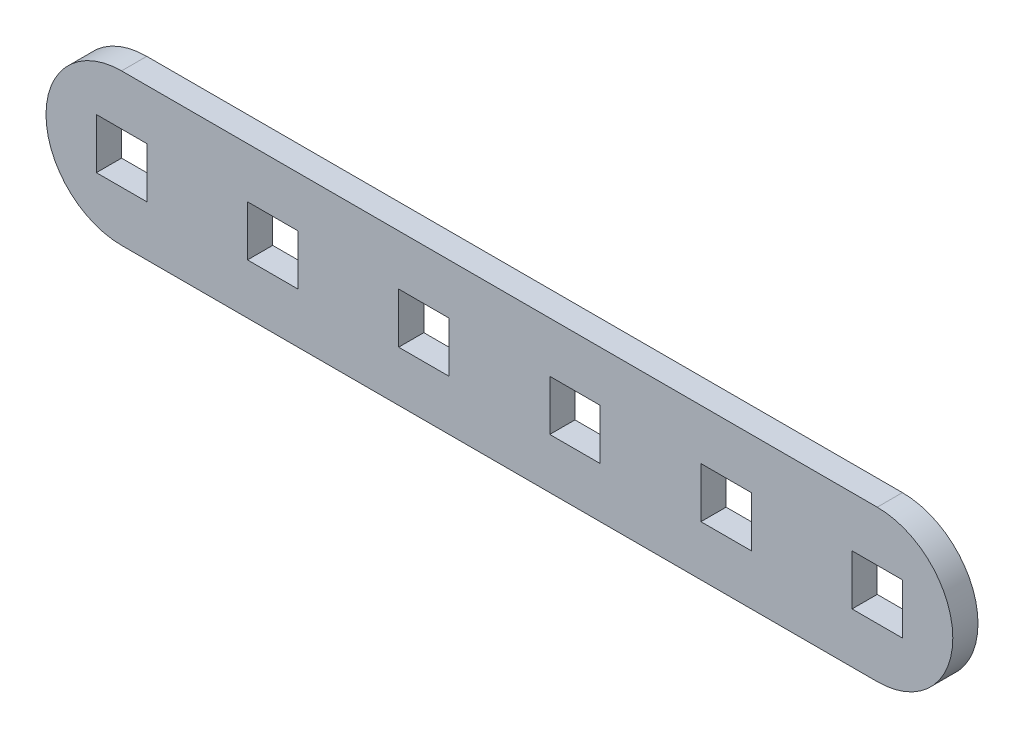
ISO-10303-21;
HEADER;
FILE_DESCRIPTION(('STEP AP214'),'2;1');
FILE_NAME('part.step','',(''),(''),'','','');
FILE_SCHEMA(('AUTOMOTIVE_DESIGN { 1 0 10303 214 1 1 1 1 }'));
ENDSEC;
DATA;
#1=APPLICATION_CONTEXT('core data for automotive mechanical design processes');
#2=APPLICATION_PROTOCOL_DEFINITION('international standard','automotive_design',2000,#1);
#3=PRODUCT_CONTEXT('',#1,'mechanical');
#4=PRODUCT('Part','Part','',(#3));
#5=PRODUCT_RELATED_PRODUCT_CATEGORY('part','',(#4));
#6=PRODUCT_DEFINITION_FORMATION('','',#4);
#7=PRODUCT_DEFINITION_CONTEXT('part definition',#1,'design');
#8=PRODUCT_DEFINITION('design','',#6,#7);
#9=PRODUCT_DEFINITION_SHAPE('','',#8);
#10=(LENGTH_UNIT() NAMED_UNIT(*) SI_UNIT(.MILLI.,.METRE.));
#11=(NAMED_UNIT(*) PLANE_ANGLE_UNIT() SI_UNIT($,.RADIAN.));
#12=(NAMED_UNIT(*) SI_UNIT($,.STERADIAN.) SOLID_ANGLE_UNIT());
#13=UNCERTAINTY_MEASURE_WITH_UNIT(LENGTH_MEASURE(1.E-05),#10,'distance_accuracy_value','');
#14=(GEOMETRIC_REPRESENTATION_CONTEXT(3) GLOBAL_UNCERTAINTY_ASSIGNED_CONTEXT((#13)) GLOBAL_UNIT_ASSIGNED_CONTEXT((#10,
#11,#12)) REPRESENTATION_CONTEXT('',''));
#15=CARTESIAN_POINT('',(0.,0.,0.));
#16=DIRECTION('',(0.,0.,1.));
#17=DIRECTION('',(1.,0.,0.));
#18=AXIS2_PLACEMENT_3D('',#15,#16,#17);
#19=CARTESIAN_POINT('',(49.6812224812,292.1364750946,1.5));
#20=DIRECTION('',(1.,0.,0.));
#21=DIRECTION('',(0.,1.,0.));
#22=AXIS2_PLACEMENT_3D('',#19,#20,#21);
#23=PLANE('',#22);
#24=DIRECTION('',(0.,0.,1.));
#25=VECTOR('',#24,1.);
#26=CARTESIAN_POINT('',(49.6812224812,295.1364750946,1.5));
#27=LINE('',#26,#25);
#28=CARTESIAN_POINT('',(49.6812224812,295.1364750946,0.));
#29=VERTEX_POINT('',#28);
#30=CARTESIAN_POINT('',(49.6812224812,295.1364750946,1.5));
#31=VERTEX_POINT('',#30);
#32=EDGE_CURVE('E11',#29,#31,#27,.T.);
#33=ORIENTED_EDGE('',*,*,#32,.F.);
#34=DIRECTION('',(0.,1.,0.));
#35=VECTOR('',#34,1.);
#36=CARTESIAN_POINT('',(49.6812224812,293.6364750946,0.));
#37=LINE('',#36,#35);
#38=CARTESIAN_POINT('',(49.6812224812,292.1364750946,0.));
#39=VERTEX_POINT('',#38);
#40=EDGE_CURVE('E168',#39,#29,#37,.T.);
#41=ORIENTED_EDGE('',*,*,#40,.F.);
#42=DIRECTION('',(0.,0.,1.));
#43=VECTOR('',#42,1.);
#44=CARTESIAN_POINT('',(49.6812224812,292.1364750946,1.5));
#45=LINE('',#44,#43);
#46=CARTESIAN_POINT('',(49.6812224812,292.1364750946,1.5));
#47=VERTEX_POINT('',#46);
#48=EDGE_CURVE('E51',#39,#47,#45,.T.);
#49=ORIENTED_EDGE('',*,*,#48,.T.);
#50=DIRECTION('',(0.,1.,0.));
#51=VECTOR('',#50,1.);
#52=CARTESIAN_POINT('',(49.6812224812,292.1364750946,1.5));
#53=LINE('',#52,#51);
#54=EDGE_CURVE('E258',#47,#31,#53,.T.);
#55=ORIENTED_EDGE('',*,*,#54,.T.);
#56=EDGE_LOOP('',(#33,#41,#49,#55));
#57=FACE_BOUND('',#56,.T.);
#58=ADVANCED_FACE('F41',(#57),#23,.F.);
#59=CARTESIAN_POINT('',(46.6812224812,292.1364750946,1.5));
#60=DIRECTION('',(0.,-1.,0.));
#61=DIRECTION('',(1.,0.,0.));
#62=AXIS2_PLACEMENT_3D('',#59,#60,#61);
#63=PLANE('',#62);
#64=ORIENTED_EDGE('',*,*,#48,.F.);
#65=DIRECTION('',(1.,0.,0.));
#66=VECTOR('',#65,1.);
#67=CARTESIAN_POINT('',(12.1812224812,292.1364750946,0.));
#68=LINE('',#67,#66);
#69=CARTESIAN_POINT('',(46.6812224812,292.1364750946,0.));
#70=VERTEX_POINT('',#69);
#71=EDGE_CURVE('E180',#70,#39,#68,.T.);
#72=ORIENTED_EDGE('',*,*,#71,.F.);
#73=DIRECTION('',(0.,0.,1.));
#74=VECTOR('',#73,1.);
#75=CARTESIAN_POINT('',(46.6812224812,292.1364750946,1.5));
#76=LINE('',#75,#74);
#77=CARTESIAN_POINT('',(46.6812224812,292.1364750946,1.5));
#78=VERTEX_POINT('',#77);
#79=EDGE_CURVE('E59',#70,#78,#76,.T.);
#80=ORIENTED_EDGE('',*,*,#79,.T.);
#81=DIRECTION('',(1.,0.,0.));
#82=VECTOR('',#81,1.);
#83=CARTESIAN_POINT('',(46.6812224812,292.1364750946,1.5));
#84=LINE('',#83,#82);
#85=EDGE_CURVE('E197',#78,#47,#84,.T.);
#86=ORIENTED_EDGE('',*,*,#85,.T.);
#87=EDGE_LOOP('',(#64,#72,#80,#86));
#88=FACE_BOUND('',#87,.T.);
#89=ADVANCED_FACE('F264',(#88),#63,.F.);
#90=CARTESIAN_POINT('',(46.6812224812,295.1364750946,1.5));
#91=DIRECTION('',(-1.,0.,0.));
#92=DIRECTION('',(0.,-1.,0.));
#93=AXIS2_PLACEMENT_3D('',#90,#91,#92);
#94=PLANE('',#93);
#95=ORIENTED_EDGE('',*,*,#79,.F.);
#96=DIRECTION('',(0.,1.,0.));
#97=VECTOR('',#96,1.);
#98=CARTESIAN_POINT('',(46.6812224812,293.6364750946,0.));
#99=LINE('',#98,#97);
#100=CARTESIAN_POINT('',(46.6812224812,295.1364750946,0.));
#101=VERTEX_POINT('',#100);
#102=EDGE_CURVE('E167',#101,#70,#99,.F.);
#103=ORIENTED_EDGE('',*,*,#102,.F.);
#104=DIRECTION('',(0.,0.,1.));
#105=VECTOR('',#104,1.);
#106=CARTESIAN_POINT('',(46.6812224812,295.1364750946,1.5));
#107=LINE('',#106,#105);
#108=CARTESIAN_POINT('',(46.6812224812,295.1364750946,1.5));
#109=VERTEX_POINT('',#108);
#110=EDGE_CURVE('E45',#101,#109,#107,.T.);
#111=ORIENTED_EDGE('',*,*,#110,.T.);
#112=DIRECTION('',(0.,-1.,0.));
#113=VECTOR('',#112,1.);
#114=CARTESIAN_POINT('',(46.6812224812,295.1364750946,1.5));
#115=LINE('',#114,#113);
#116=EDGE_CURVE('E501',#109,#78,#115,.T.);
#117=ORIENTED_EDGE('',*,*,#116,.T.);
#118=EDGE_LOOP('',(#95,#103,#111,#117));
#119=FACE_BOUND('',#118,.T.);
#120=ADVANCED_FACE('F170',(#119),#94,.F.);
#121=CARTESIAN_POINT('',(40.6812224812,292.1364750946,1.5));
#122=DIRECTION('',(1.,0.,0.));
#123=DIRECTION('',(0.,1.,0.));
#124=AXIS2_PLACEMENT_3D('',#121,#122,#123);
#125=PLANE('',#124);
#126=DIRECTION('',(0.,0.,1.));
#127=VECTOR('',#126,1.);
#128=CARTESIAN_POINT('',(40.6812224812,295.1364750946,1.5));
#129=LINE('',#128,#127);
#130=CARTESIAN_POINT('',(40.6812224812,295.1364750946,0.));
#131=VERTEX_POINT('',#130);
#132=CARTESIAN_POINT('',(40.6812224812,295.1364750946,1.5));
#133=VERTEX_POINT('',#132);
#134=EDGE_CURVE('E162',#131,#133,#129,.T.);
#135=ORIENTED_EDGE('',*,*,#134,.F.);
#136=DIRECTION('',(0.,1.,0.));
#137=VECTOR('',#136,1.);
#138=CARTESIAN_POINT('',(40.6812224812,293.6364750946,0.));
#139=LINE('',#138,#137);
#140=CARTESIAN_POINT('',(40.6812224812,292.1364750946,0.));
#141=VERTEX_POINT('',#140);
#142=EDGE_CURVE('E174',#141,#131,#139,.T.);
#143=ORIENTED_EDGE('',*,*,#142,.F.);
#144=DIRECTION('',(0.,0.,1.));
#145=VECTOR('',#144,1.);
#146=CARTESIAN_POINT('',(40.6812224812,292.1364750946,1.5));
#147=LINE('',#146,#145);
#148=CARTESIAN_POINT('',(40.6812224812,292.1364750946,1.5));
#149=VERTEX_POINT('',#148);
#150=EDGE_CURVE('E249',#141,#149,#147,.T.);
#151=ORIENTED_EDGE('',*,*,#150,.T.);
#152=DIRECTION('',(0.,1.,0.));
#153=VECTOR('',#152,1.);
#154=CARTESIAN_POINT('',(40.6812224812,292.1364750946,1.5));
#155=LINE('',#154,#153);
#156=EDGE_CURVE('E495',#149,#133,#155,.T.);
#157=ORIENTED_EDGE('',*,*,#156,.T.);
#158=EDGE_LOOP('',(#135,#143,#151,#157));
#159=FACE_BOUND('',#158,.T.);
#160=ADVANCED_FACE('F506',(#159),#125,.F.);
#161=CARTESIAN_POINT('',(37.6812224812,292.1364750946,1.5));
#162=DIRECTION('',(0.,-1.,0.));
#163=DIRECTION('',(1.,0.,0.));
#164=AXIS2_PLACEMENT_3D('',#161,#162,#163);
#165=PLANE('',#164);
#166=ORIENTED_EDGE('',*,*,#150,.F.);
#167=DIRECTION('',(1.,0.,0.));
#168=VECTOR('',#167,1.);
#169=CARTESIAN_POINT('',(12.1812224812,292.1364750946,0.));
#170=LINE('',#169,#168);
#171=CARTESIAN_POINT('',(37.6812224812,292.1364750946,0.));
#172=VERTEX_POINT('',#171);
#173=EDGE_CURVE('E171',#172,#141,#170,.T.);
#174=ORIENTED_EDGE('',*,*,#173,.F.);
#175=DIRECTION('',(0.,0.,1.));
#176=VECTOR('',#175,1.);
#177=CARTESIAN_POINT('',(37.6812224812,292.1364750946,1.5));
#178=LINE('',#177,#176);
#179=CARTESIAN_POINT('',(37.6812224812,292.1364750946,1.5));
#180=VERTEX_POINT('',#179);
#181=EDGE_CURVE('E246',#172,#180,#178,.T.);
#182=ORIENTED_EDGE('',*,*,#181,.T.);
#183=DIRECTION('',(1.,0.,0.));
#184=VECTOR('',#183,1.);
#185=CARTESIAN_POINT('',(37.6812224812,292.1364750946,1.5));
#186=LINE('',#185,#184);
#187=EDGE_CURVE('E351',#180,#149,#186,.T.);
#188=ORIENTED_EDGE('',*,*,#187,.T.);
#189=EDGE_LOOP('',(#166,#174,#182,#188));
#190=FACE_BOUND('',#189,.T.);
#191=ADVANCED_FACE('F349',(#190),#165,.F.);
#192=CARTESIAN_POINT('',(37.6812224812,295.1364750946,1.5));
#193=DIRECTION('',(-1.,0.,0.));
#194=DIRECTION('',(0.,-1.,0.));
#195=AXIS2_PLACEMENT_3D('',#192,#193,#194);
#196=PLANE('',#195);
#197=ORIENTED_EDGE('',*,*,#181,.F.);
#198=DIRECTION('',(0.,1.,0.));
#199=VECTOR('',#198,1.);
#200=CARTESIAN_POINT('',(37.6812224812,293.6364750946,0.));
#201=LINE('',#200,#199);
#202=CARTESIAN_POINT('',(37.6812224812,295.1364750946,0.));
#203=VERTEX_POINT('',#202);
#204=EDGE_CURVE('E324',#203,#172,#201,.F.);
#205=ORIENTED_EDGE('',*,*,#204,.F.);
#206=DIRECTION('',(0.,0.,1.));
#207=VECTOR('',#206,1.);
#208=CARTESIAN_POINT('',(37.6812224812,295.1364750946,1.5));
#209=LINE('',#208,#207);
#210=CARTESIAN_POINT('',(37.6812224812,295.1364750946,1.5));
#211=VERTEX_POINT('',#210);
#212=EDGE_CURVE('E243',#203,#211,#209,.T.);
#213=ORIENTED_EDGE('',*,*,#212,.T.);
#214=DIRECTION('',(0.,-1.,0.));
#215=VECTOR('',#214,1.);
#216=CARTESIAN_POINT('',(37.6812224812,295.1364750946,1.5));
#217=LINE('',#216,#215);
#218=EDGE_CURVE('E345',#211,#180,#217,.T.);
#219=ORIENTED_EDGE('',*,*,#218,.T.);
#220=EDGE_LOOP('',(#197,#205,#213,#219));
#221=FACE_BOUND('',#220,.T.);
#222=ADVANCED_FACE('F340',(#221),#196,.F.);
#223=CARTESIAN_POINT('',(22.6812224812,292.1364750946,1.5));
#224=DIRECTION('',(1.,0.,0.));
#225=DIRECTION('',(0.,1.,0.));
#226=AXIS2_PLACEMENT_3D('',#223,#224,#225);
#227=PLANE('',#226);
#228=DIRECTION('',(0.,0.,1.));
#229=VECTOR('',#228,1.);
#230=CARTESIAN_POINT('',(22.6812224812,295.1364750946,1.5));
#231=LINE('',#230,#229);
#232=CARTESIAN_POINT('',(22.6812224812,295.1364750946,0.));
#233=VERTEX_POINT('',#232);
#234=CARTESIAN_POINT('',(22.6812224812,295.1364750946,1.5));
#235=VERTEX_POINT('',#234);
#236=EDGE_CURVE('E240',#233,#235,#231,.T.);
#237=ORIENTED_EDGE('',*,*,#236,.F.);
#238=DIRECTION('',(0.,1.,0.));
#239=VECTOR('',#238,1.);
#240=CARTESIAN_POINT('',(22.6812224812,293.6364750946,0.));
#241=LINE('',#240,#239);
#242=CARTESIAN_POINT('',(22.6812224812,292.1364750946,0.));
#243=VERTEX_POINT('',#242);
#244=EDGE_CURVE('E325',#243,#233,#241,.T.);
#245=ORIENTED_EDGE('',*,*,#244,.F.);
#246=DIRECTION('',(0.,0.,1.));
#247=VECTOR('',#246,1.);
#248=CARTESIAN_POINT('',(22.6812224812,292.1364750946,1.5));
#249=LINE('',#248,#247);
#250=CARTESIAN_POINT('',(22.6812224812,292.1364750946,1.5));
#251=VERTEX_POINT('',#250);
#252=EDGE_CURVE('E237',#243,#251,#249,.T.);
#253=ORIENTED_EDGE('',*,*,#252,.T.);
#254=DIRECTION('',(0.,1.,0.));
#255=VECTOR('',#254,1.);
#256=CARTESIAN_POINT('',(22.6812224812,292.1364750946,1.5));
#257=LINE('',#256,#255);
#258=EDGE_CURVE('E481',#251,#235,#257,.T.);
#259=ORIENTED_EDGE('',*,*,#258,.T.);
#260=EDGE_LOOP('',(#237,#245,#253,#259));
#261=FACE_BOUND('',#260,.T.);
#262=ADVANCED_FACE('F537',(#261),#227,.F.);
#263=CARTESIAN_POINT('',(19.6812224812,292.1364750946,1.5));
#264=DIRECTION('',(0.,-1.,0.));
#265=DIRECTION('',(1.,0.,0.));
#266=AXIS2_PLACEMENT_3D('',#263,#264,#265);
#267=PLANE('',#266);
#268=ORIENTED_EDGE('',*,*,#252,.F.);
#269=DIRECTION('',(1.,0.,0.));
#270=VECTOR('',#269,1.);
#271=CARTESIAN_POINT('',(12.1812224812,292.1364750946,0.));
#272=LINE('',#271,#270);
#273=CARTESIAN_POINT('',(19.6812224812,292.1364750946,0.));
#274=VERTEX_POINT('',#273);
#275=EDGE_CURVE('E321',#274,#243,#272,.T.);
#276=ORIENTED_EDGE('',*,*,#275,.F.);
#277=DIRECTION('',(0.,0.,1.));
#278=VECTOR('',#277,1.);
#279=CARTESIAN_POINT('',(19.6812224812,292.1364750946,1.5));
#280=LINE('',#279,#278);
#281=CARTESIAN_POINT('',(19.6812224812,292.1364750946,1.5));
#282=VERTEX_POINT('',#281);
#283=EDGE_CURVE('E234',#274,#282,#280,.T.);
#284=ORIENTED_EDGE('',*,*,#283,.T.);
#285=DIRECTION('',(1.,0.,0.));
#286=VECTOR('',#285,1.);
#287=CARTESIAN_POINT('',(19.6812224812,292.1364750946,1.5));
#288=LINE('',#287,#286);
#289=EDGE_CURVE('E485',#282,#251,#288,.T.);
#290=ORIENTED_EDGE('',*,*,#289,.T.);
#291=EDGE_LOOP('',(#268,#276,#284,#290));
#292=FACE_BOUND('',#291,.T.);
#293=ADVANCED_FACE('F541',(#292),#267,.F.);
#294=CARTESIAN_POINT('',(19.6812224812,295.1364750946,1.5));
#295=DIRECTION('',(-1.,0.,0.));
#296=DIRECTION('',(0.,-1.,0.));
#297=AXIS2_PLACEMENT_3D('',#294,#295,#296);
#298=PLANE('',#297);
#299=ORIENTED_EDGE('',*,*,#283,.F.);
#300=DIRECTION('',(0.,1.,0.));
#301=VECTOR('',#300,1.);
#302=CARTESIAN_POINT('',(19.6812224812,293.6364750946,0.));
#303=LINE('',#302,#301);
#304=CARTESIAN_POINT('',(19.6812224812,295.1364750946,0.));
#305=VERTEX_POINT('',#304);
#306=EDGE_CURVE('E312',#305,#274,#303,.F.);
#307=ORIENTED_EDGE('',*,*,#306,.F.);
#308=DIRECTION('',(0.,0.,1.));
#309=VECTOR('',#308,1.);
#310=CARTESIAN_POINT('',(19.6812224812,295.1364750946,1.5));
#311=LINE('',#310,#309);
#312=CARTESIAN_POINT('',(19.6812224812,295.1364750946,1.5));
#313=VERTEX_POINT('',#312);
#314=EDGE_CURVE('E231',#305,#313,#311,.T.);
#315=ORIENTED_EDGE('',*,*,#314,.T.);
#316=DIRECTION('',(0.,-1.,0.));
#317=VECTOR('',#316,1.);
#318=CARTESIAN_POINT('',(19.6812224812,295.1364750946,1.5));
#319=LINE('',#318,#317);
#320=EDGE_CURVE('E473',#313,#282,#319,.T.);
#321=ORIENTED_EDGE('',*,*,#320,.T.);
#322=EDGE_LOOP('',(#299,#307,#315,#321));
#323=FACE_BOUND('',#322,.T.);
#324=ADVANCED_FACE('F545',(#323),#298,.F.);
#325=CARTESIAN_POINT('',(57.1812224812,293.6364750946,1.5));
#326=DIRECTION('',(0.,0.,1.));
#327=DIRECTION('',(1.,0.,0.));
#328=AXIS2_PLACEMENT_3D('',#325,#326,#327);
#329=CYLINDRICAL_SURFACE('',#328,4.5);
#330=DIRECTION('',(0.,0.,1.));
#331=VECTOR('',#330,1.);
#332=CARTESIAN_POINT('',(57.1812224812,289.1364750946,1.5));
#333=LINE('',#332,#331);
#334=CARTESIAN_POINT('',(57.1812224812,289.1364750946,0.));
#335=VERTEX_POINT('',#334);
#336=CARTESIAN_POINT('',(57.1812224812,289.1364750946,1.5));
#337=VERTEX_POINT('',#336);
#338=EDGE_CURVE('E228',#335,#337,#333,.T.);
#339=ORIENTED_EDGE('',*,*,#338,.F.);
#340=CARTESIAN_POINT('',(57.1812224812,293.6364750946,0.));
#341=DIRECTION('',(0.,0.,1.));
#342=DIRECTION('',(1.,0.,0.));
#343=AXIS2_PLACEMENT_3D('',#340,#341,#342);
#344=CIRCLE('',#343,4.5);
#345=CARTESIAN_POINT('',(57.1812224812,298.1364750946,0.));
#346=VERTEX_POINT('',#345);
#347=EDGE_CURVE('E313',#335,#346,#344,.T.);
#348=ORIENTED_EDGE('',*,*,#347,.T.);
#349=DIRECTION('',(0.,0.,1.));
#350=VECTOR('',#349,1.);
#351=CARTESIAN_POINT('',(57.1812224812,298.1364750946,1.5));
#352=LINE('',#351,#350);
#353=CARTESIAN_POINT('',(57.1812224812,298.1364750946,1.5));
#354=VERTEX_POINT('',#353);
#355=EDGE_CURVE('E225',#346,#354,#352,.T.);
#356=ORIENTED_EDGE('',*,*,#355,.T.);
#357=CARTESIAN_POINT('',(57.1812224812,293.6364750946,1.5));
#358=DIRECTION('',(0.,0.,1.));
#359=DIRECTION('',(1.,0.,0.));
#360=AXIS2_PLACEMENT_3D('',#357,#358,#359);
#361=CIRCLE('',#360,4.5);
#362=EDGE_CURVE('E465',#337,#354,#361,.T.);
#363=ORIENTED_EDGE('',*,*,#362,.F.);
#364=EDGE_LOOP('',(#339,#348,#356,#363));
#365=FACE_BOUND('',#364,.T.);
#366=ADVANCED_FACE('F549',(#365),#329,.T.);
#367=CARTESIAN_POINT('',(12.1812224812,298.1364750946,1.5));
#368=DIRECTION('',(0.,1.,0.));
#369=DIRECTION('',(-1.,0.,0.));
#370=AXIS2_PLACEMENT_3D('',#367,#368,#369);
#371=PLANE('',#370);
#372=ORIENTED_EDGE('',*,*,#355,.F.);
#373=DIRECTION('',(1.,0.,0.));
#374=VECTOR('',#373,1.);
#375=CARTESIAN_POINT('',(12.1812224812,298.1364750946,0.));
#376=LINE('',#375,#374);
#377=CARTESIAN_POINT('',(12.1812224812,298.1364750946,0.));
#378=VERTEX_POINT('',#377);
#379=EDGE_CURVE('E309',#346,#378,#376,.F.);
#380=ORIENTED_EDGE('',*,*,#379,.T.);
#381=DIRECTION('',(0.,0.,1.));
#382=VECTOR('',#381,1.);
#383=CARTESIAN_POINT('',(12.1812224812,298.1364750946,1.5));
#384=LINE('',#383,#382);
#385=CARTESIAN_POINT('',(12.1812224812,298.1364750946,1.5));
#386=VERTEX_POINT('',#385);
#387=EDGE_CURVE('E222',#378,#386,#384,.T.);
#388=ORIENTED_EDGE('',*,*,#387,.T.);
#389=DIRECTION('',(-1.,0.,0.));
#390=VECTOR('',#389,1.);
#391=CARTESIAN_POINT('',(12.1812224812,298.1364750946,1.5));
#392=LINE('',#391,#390);
#393=EDGE_CURVE('E469',#354,#386,#392,.T.);
#394=ORIENTED_EDGE('',*,*,#393,.F.);
#395=EDGE_LOOP('',(#372,#380,#388,#394));
#396=FACE_BOUND('',#395,.T.);
#397=ADVANCED_FACE('F557',(#396),#371,.T.);
#398=CARTESIAN_POINT('',(12.1812224812,293.6364750946,1.5));
#399=DIRECTION('',(0.,0.,1.));
#400=DIRECTION('',(1.,0.,0.));
#401=AXIS2_PLACEMENT_3D('',#398,#399,#400);
#402=CYLINDRICAL_SURFACE('',#401,4.5);
#403=ORIENTED_EDGE('',*,*,#387,.F.);
#404=CARTESIAN_POINT('',(12.1812224812,293.6364750946,0.));
#405=DIRECTION('',(0.,0.,1.));
#406=DIRECTION('',(1.,0.,0.));
#407=AXIS2_PLACEMENT_3D('',#404,#405,#406);
#408=CIRCLE('',#407,4.5);
#409=CARTESIAN_POINT('',(12.1812224812,289.1364750946,0.));
#410=VERTEX_POINT('',#409);
#411=EDGE_CURVE('E300',#378,#410,#408,.T.);
#412=ORIENTED_EDGE('',*,*,#411,.T.);
#413=DIRECTION('',(0.,0.,1.));
#414=VECTOR('',#413,1.);
#415=CARTESIAN_POINT('',(12.1812224812,289.1364750946,1.5));
#416=LINE('',#415,#414);
#417=CARTESIAN_POINT('',(12.1812224812,289.1364750946,1.5));
#418=VERTEX_POINT('',#417);
#419=EDGE_CURVE('E219',#410,#418,#416,.T.);
#420=ORIENTED_EDGE('',*,*,#419,.T.);
#421=CARTESIAN_POINT('',(12.1812224812,293.6364750946,1.5));
#422=DIRECTION('',(0.,0.,1.));
#423=DIRECTION('',(1.,0.,0.));
#424=AXIS2_PLACEMENT_3D('',#421,#422,#423);
#425=CIRCLE('',#424,4.5);
#426=EDGE_CURVE('E457',#386,#418,#425,.T.);
#427=ORIENTED_EDGE('',*,*,#426,.F.);
#428=EDGE_LOOP('',(#403,#412,#420,#427));
#429=FACE_BOUND('',#428,.T.);
#430=ADVANCED_FACE('F561',(#429),#402,.T.);
#431=CARTESIAN_POINT('',(13.6812224812,292.1364750946,1.5));
#432=DIRECTION('',(1.,0.,0.));
#433=DIRECTION('',(0.,1.,0.));
#434=AXIS2_PLACEMENT_3D('',#431,#432,#433);
#435=PLANE('',#434);
#436=DIRECTION('',(0.,0.,1.));
#437=VECTOR('',#436,1.);
#438=CARTESIAN_POINT('',(13.6812224812,295.1364750946,1.5));
#439=LINE('',#438,#437);
#440=CARTESIAN_POINT('',(13.6812224812,295.1364750946,0.));
#441=VERTEX_POINT('',#440);
#442=CARTESIAN_POINT('',(13.6812224812,295.1364750946,1.5));
#443=VERTEX_POINT('',#442);
#444=EDGE_CURVE('E216',#441,#443,#439,.T.);
#445=ORIENTED_EDGE('',*,*,#444,.F.);
#446=DIRECTION('',(0.,1.,0.));
#447=VECTOR('',#446,1.);
#448=CARTESIAN_POINT('',(13.6812224812,293.6364750946,0.));
#449=LINE('',#448,#447);
#450=CARTESIAN_POINT('',(13.6812224812,292.1364750946,0.));
#451=VERTEX_POINT('',#450);
#452=EDGE_CURVE('E301',#451,#441,#449,.T.);
#453=ORIENTED_EDGE('',*,*,#452,.F.);
#454=DIRECTION('',(0.,0.,1.));
#455=VECTOR('',#454,1.);
#456=CARTESIAN_POINT('',(13.6812224812,292.1364750946,1.5));
#457=LINE('',#456,#455);
#458=CARTESIAN_POINT('',(13.6812224812,292.1364750946,1.5));
#459=VERTEX_POINT('',#458);
#460=EDGE_CURVE('E213',#451,#459,#457,.T.);
#461=ORIENTED_EDGE('',*,*,#460,.T.);
#462=DIRECTION('',(0.,1.,0.));
#463=VECTOR('',#462,1.);
#464=CARTESIAN_POINT('',(13.6812224812,292.1364750946,1.5));
#465=LINE('',#464,#463);
#466=EDGE_CURVE('E449',#459,#443,#465,.T.);
#467=ORIENTED_EDGE('',*,*,#466,.T.);
#468=EDGE_LOOP('',(#445,#453,#461,#467));
#469=FACE_BOUND('',#468,.T.);
#470=ADVANCED_FACE('F565',(#469),#435,.F.);
#471=CARTESIAN_POINT('',(10.6812224812,292.1364750946,1.5));
#472=DIRECTION('',(0.,-1.,0.));
#473=DIRECTION('',(1.,0.,0.));
#474=AXIS2_PLACEMENT_3D('',#471,#472,#473);
#475=PLANE('',#474);
#476=ORIENTED_EDGE('',*,*,#460,.F.);
#477=DIRECTION('',(1.,0.,0.));
#478=VECTOR('',#477,1.);
#479=CARTESIAN_POINT('',(12.1812224812,292.1364750946,0.));
#480=LINE('',#479,#478);
#481=CARTESIAN_POINT('',(10.6812224812,292.1364750946,0.));
#482=VERTEX_POINT('',#481);
#483=EDGE_CURVE('E297',#482,#451,#480,.T.);
#484=ORIENTED_EDGE('',*,*,#483,.F.);
#485=DIRECTION('',(0.,0.,1.));
#486=VECTOR('',#485,1.);
#487=CARTESIAN_POINT('',(10.6812224812,292.1364750946,1.5));
#488=LINE('',#487,#486);
#489=CARTESIAN_POINT('',(10.6812224812,292.1364750946,1.5));
#490=VERTEX_POINT('',#489);
#491=EDGE_CURVE('E210',#482,#490,#488,.T.);
#492=ORIENTED_EDGE('',*,*,#491,.T.);
#493=DIRECTION('',(1.,0.,0.));
#494=VECTOR('',#493,1.);
#495=CARTESIAN_POINT('',(10.6812224812,292.1364750946,1.5));
#496=LINE('',#495,#494);
#497=EDGE_CURVE('E453',#490,#459,#496,.T.);
#498=ORIENTED_EDGE('',*,*,#497,.T.);
#499=EDGE_LOOP('',(#476,#484,#492,#498));
#500=FACE_BOUND('',#499,.T.);
#501=ADVANCED_FACE('F573',(#500),#475,.F.);
#502=CARTESIAN_POINT('',(10.6812224812,295.1364750946,1.5));
#503=DIRECTION('',(-1.,0.,0.));
#504=DIRECTION('',(0.,-1.,0.));
#505=AXIS2_PLACEMENT_3D('',#502,#503,#504);
#506=PLANE('',#505);
#507=ORIENTED_EDGE('',*,*,#491,.F.);
#508=DIRECTION('',(0.,1.,0.));
#509=VECTOR('',#508,1.);
#510=CARTESIAN_POINT('',(10.6812224812,293.6364750946,0.));
#511=LINE('',#510,#509);
#512=CARTESIAN_POINT('',(10.6812224812,295.1364750946,0.));
#513=VERTEX_POINT('',#512);
#514=EDGE_CURVE('E288',#513,#482,#511,.F.);
#515=ORIENTED_EDGE('',*,*,#514,.F.);
#516=DIRECTION('',(0.,0.,1.));
#517=VECTOR('',#516,1.);
#518=CARTESIAN_POINT('',(10.6812224812,295.1364750946,1.5));
#519=LINE('',#518,#517);
#520=CARTESIAN_POINT('',(10.6812224812,295.1364750946,1.5));
#521=VERTEX_POINT('',#520);
#522=EDGE_CURVE('E207',#513,#521,#519,.T.);
#523=ORIENTED_EDGE('',*,*,#522,.T.);
#524=DIRECTION('',(0.,-1.,0.));
#525=VECTOR('',#524,1.);
#526=CARTESIAN_POINT('',(10.6812224812,295.1364750946,1.5));
#527=LINE('',#526,#525);
#528=EDGE_CURVE('E441',#521,#490,#527,.T.);
#529=ORIENTED_EDGE('',*,*,#528,.T.);
#530=EDGE_LOOP('',(#507,#515,#523,#529));
#531=FACE_BOUND('',#530,.T.);
#532=ADVANCED_FACE('F577',(#531),#506,.F.);
#533=CARTESIAN_POINT('',(31.6812224812,292.1364750946,1.5));
#534=DIRECTION('',(1.,0.,0.));
#535=DIRECTION('',(0.,1.,0.));
#536=AXIS2_PLACEMENT_3D('',#533,#534,#535);
#537=PLANE('',#536);
#538=DIRECTION('',(0.,0.,1.));
#539=VECTOR('',#538,1.);
#540=CARTESIAN_POINT('',(31.6812224812,295.1364750946,1.5));
#541=LINE('',#540,#539);
#542=CARTESIAN_POINT('',(31.6812224812,295.1364750946,0.));
#543=VERTEX_POINT('',#542);
#544=CARTESIAN_POINT('',(31.6812224812,295.1364750946,1.5));
#545=VERTEX_POINT('',#544);
#546=EDGE_CURVE('E204',#543,#545,#541,.T.);
#547=ORIENTED_EDGE('',*,*,#546,.F.);
#548=DIRECTION('',(0.,1.,0.));
#549=VECTOR('',#548,1.);
#550=CARTESIAN_POINT('',(31.6812224812,293.6364750946,0.));
#551=LINE('',#550,#549);
#552=CARTESIAN_POINT('',(31.6812224812,292.1364750946,0.));
#553=VERTEX_POINT('',#552);
#554=EDGE_CURVE('E289',#553,#543,#551,.T.);
#555=ORIENTED_EDGE('',*,*,#554,.F.);
#556=DIRECTION('',(0.,0.,1.));
#557=VECTOR('',#556,1.);
#558=CARTESIAN_POINT('',(31.6812224812,292.1364750946,1.5));
#559=LINE('',#558,#557);
#560=CARTESIAN_POINT('',(31.6812224812,292.1364750946,1.5));
#561=VERTEX_POINT('',#560);
#562=EDGE_CURVE('E201',#553,#561,#559,.T.);
#563=ORIENTED_EDGE('',*,*,#562,.T.);
#564=DIRECTION('',(0.,1.,0.));
#565=VECTOR('',#564,1.);
#566=CARTESIAN_POINT('',(31.6812224812,292.1364750946,1.5));
#567=LINE('',#566,#565);
#568=EDGE_CURVE('E433',#561,#545,#567,.T.);
#569=ORIENTED_EDGE('',*,*,#568,.T.);
#570=EDGE_LOOP('',(#547,#555,#563,#569));
#571=FACE_BOUND('',#570,.T.);
#572=ADVANCED_FACE('F581',(#571),#537,.F.);
#573=CARTESIAN_POINT('',(28.6812224812,292.1364750946,1.5));
#574=DIRECTION('',(0.,-1.,0.));
#575=DIRECTION('',(1.,0.,0.));
#576=AXIS2_PLACEMENT_3D('',#573,#574,#575);
#577=PLANE('',#576);
#578=ORIENTED_EDGE('',*,*,#562,.F.);
#579=DIRECTION('',(1.,0.,0.));
#580=VECTOR('',#579,1.);
#581=CARTESIAN_POINT('',(12.1812224812,292.1364750946,0.));
#582=LINE('',#581,#580);
#583=CARTESIAN_POINT('',(28.6812224812,292.1364750946,0.));
#584=VERTEX_POINT('',#583);
#585=EDGE_CURVE('E285',#584,#553,#582,.T.);
#586=ORIENTED_EDGE('',*,*,#585,.F.);
#587=DIRECTION('',(0.,0.,1.));
#588=VECTOR('',#587,1.);
#589=CARTESIAN_POINT('',(28.6812224812,292.1364750946,1.5));
#590=LINE('',#589,#588);
#591=CARTESIAN_POINT('',(28.6812224812,292.1364750946,1.5));
#592=VERTEX_POINT('',#591);
#593=EDGE_CURVE('E198',#584,#592,#590,.T.);
#594=ORIENTED_EDGE('',*,*,#593,.T.);
#595=DIRECTION('',(1.,0.,0.));
#596=VECTOR('',#595,1.);
#597=CARTESIAN_POINT('',(28.6812224812,292.1364750946,1.5));
#598=LINE('',#597,#596);
#599=EDGE_CURVE('E437',#592,#561,#598,.T.);
#600=ORIENTED_EDGE('',*,*,#599,.T.);
#601=EDGE_LOOP('',(#578,#586,#594,#600));
#602=FACE_BOUND('',#601,.T.);
#603=ADVANCED_FACE('F588',(#602),#577,.F.);
#604=CARTESIAN_POINT('',(28.6812224812,295.1364750946,1.5));
#605=DIRECTION('',(-1.,0.,0.));
#606=DIRECTION('',(0.,-1.,0.));
#607=AXIS2_PLACEMENT_3D('',#604,#605,#606);
#608=PLANE('',#607);
#609=ORIENTED_EDGE('',*,*,#593,.F.);
#610=DIRECTION('',(0.,1.,0.));
#611=VECTOR('',#610,1.);
#612=CARTESIAN_POINT('',(28.6812224812,293.6364750946,0.));
#613=LINE('',#612,#611);
#614=CARTESIAN_POINT('',(28.6812224812,295.1364750946,0.));
#615=VERTEX_POINT('',#614);
#616=EDGE_CURVE('E276',#615,#584,#613,.F.);
#617=ORIENTED_EDGE('',*,*,#616,.F.);
#618=DIRECTION('',(0.,0.,1.));
#619=VECTOR('',#618,1.);
#620=CARTESIAN_POINT('',(28.6812224812,295.1364750946,1.5));
#621=LINE('',#620,#619);
#622=CARTESIAN_POINT('',(28.6812224812,295.1364750946,1.5));
#623=VERTEX_POINT('',#622);
#624=EDGE_CURVE('E194',#615,#623,#621,.T.);
#625=ORIENTED_EDGE('',*,*,#624,.T.);
#626=DIRECTION('',(0.,-1.,0.));
#627=VECTOR('',#626,1.);
#628=CARTESIAN_POINT('',(28.6812224812,295.1364750946,1.5));
#629=LINE('',#628,#627);
#630=EDGE_CURVE('E425',#623,#592,#629,.T.);
#631=ORIENTED_EDGE('',*,*,#630,.T.);
#632=EDGE_LOOP('',(#609,#617,#625,#631));
#633=FACE_BOUND('',#632,.T.);
#634=ADVANCED_FACE('F592',(#633),#608,.F.);
#635=CARTESIAN_POINT('',(58.6812224812,292.1364750946,1.5));
#636=DIRECTION('',(1.,0.,0.));
#637=DIRECTION('',(0.,1.,0.));
#638=AXIS2_PLACEMENT_3D('',#635,#636,#637);
#639=PLANE('',#638);
#640=DIRECTION('',(0.,0.,1.));
#641=VECTOR('',#640,1.);
#642=CARTESIAN_POINT('',(58.6812224812,295.1364750946,1.5));
#643=LINE('',#642,#641);
#644=CARTESIAN_POINT('',(58.6812224812,295.1364750946,0.));
#645=VERTEX_POINT('',#644);
#646=CARTESIAN_POINT('',(58.6812224812,295.1364750946,1.5));
#647=VERTEX_POINT('',#646);
#648=EDGE_CURVE('E191',#645,#647,#643,.T.);
#649=ORIENTED_EDGE('',*,*,#648,.F.);
#650=DIRECTION('',(0.,1.,0.));
#651=VECTOR('',#650,1.);
#652=CARTESIAN_POINT('',(58.6812224812,293.6364750946,0.));
#653=LINE('',#652,#651);
#654=CARTESIAN_POINT('',(58.6812224812,292.1364750946,0.));
#655=VERTEX_POINT('',#654);
#656=EDGE_CURVE('E277',#655,#645,#653,.T.);
#657=ORIENTED_EDGE('',*,*,#656,.F.);
#658=DIRECTION('',(0.,0.,1.));
#659=VECTOR('',#658,1.);
#660=CARTESIAN_POINT('',(58.6812224812,292.1364750946,1.5));
#661=LINE('',#660,#659);
#662=CARTESIAN_POINT('',(58.6812224812,292.1364750946,1.5));
#663=VERTEX_POINT('',#662);
#664=EDGE_CURVE('E187',#655,#663,#661,.T.);
#665=ORIENTED_EDGE('',*,*,#664,.T.);
#666=DIRECTION('',(0.,1.,0.));
#667=VECTOR('',#666,1.);
#668=CARTESIAN_POINT('',(58.6812224812,292.1364750946,1.5));
#669=LINE('',#668,#667);
#670=EDGE_CURVE('E418',#663,#647,#669,.T.);
#671=ORIENTED_EDGE('',*,*,#670,.T.);
#672=EDGE_LOOP('',(#649,#657,#665,#671));
#673=FACE_BOUND('',#672,.T.);
#674=ADVANCED_FACE('F596',(#673),#639,.F.);
#675=CARTESIAN_POINT('',(55.6812224812,292.1364750946,1.5));
#676=DIRECTION('',(0.,-1.,0.));
#677=DIRECTION('',(1.,0.,0.));
#678=AXIS2_PLACEMENT_3D('',#675,#676,#677);
#679=PLANE('',#678);
#680=ORIENTED_EDGE('',*,*,#664,.F.);
#681=DIRECTION('',(1.,0.,0.));
#682=VECTOR('',#681,1.);
#683=CARTESIAN_POINT('',(12.1812224812,292.1364750946,0.));
#684=LINE('',#683,#682);
#685=CARTESIAN_POINT('',(55.6812224812,292.1364750946,0.));
#686=VERTEX_POINT('',#685);
#687=EDGE_CURVE('E273',#686,#655,#684,.T.);
#688=ORIENTED_EDGE('',*,*,#687,.F.);
#689=DIRECTION('',(0.,0.,1.));
#690=VECTOR('',#689,1.);
#691=CARTESIAN_POINT('',(55.6812224812,292.1364750946,1.5));
#692=LINE('',#691,#690);
#693=CARTESIAN_POINT('',(55.6812224812,292.1364750946,1.5));
#694=VERTEX_POINT('',#693);
#695=EDGE_CURVE('E184',#686,#694,#692,.T.);
#696=ORIENTED_EDGE('',*,*,#695,.T.);
#697=DIRECTION('',(1.,0.,0.));
#698=VECTOR('',#697,1.);
#699=CARTESIAN_POINT('',(55.6812224812,292.1364750946,1.5));
#700=LINE('',#699,#698);
#701=EDGE_CURVE('E413',#694,#663,#700,.T.);
#702=ORIENTED_EDGE('',*,*,#701,.T.);
#703=EDGE_LOOP('',(#680,#688,#696,#702));
#704=FACE_BOUND('',#703,.T.);
#705=ADVANCED_FACE('F602',(#704),#679,.F.);
#706=CARTESIAN_POINT('',(55.6812224812,295.1364750946,1.5));
#707=DIRECTION('',(-1.,0.,0.));
#708=DIRECTION('',(0.,-1.,0.));
#709=AXIS2_PLACEMENT_3D('',#706,#707,#708);
#710=PLANE('',#709);
#711=ORIENTED_EDGE('',*,*,#695,.F.);
#712=DIRECTION('',(0.,1.,0.));
#713=VECTOR('',#712,1.);
#714=CARTESIAN_POINT('',(55.6812224812,293.6364750946,0.));
#715=LINE('',#714,#713);
#716=CARTESIAN_POINT('',(55.6812224812,295.1364750946,0.));
#717=VERTEX_POINT('',#716);
#718=EDGE_CURVE('E269',#717,#686,#715,.F.);
#719=ORIENTED_EDGE('',*,*,#718,.F.);
#720=DIRECTION('',(0.,0.,1.));
#721=VECTOR('',#720,1.);
#722=CARTESIAN_POINT('',(55.6812224812,295.1364750946,1.5));
#723=LINE('',#722,#721);
#724=CARTESIAN_POINT('',(55.6812224812,295.1364750946,1.5));
#725=VERTEX_POINT('',#724);
#726=EDGE_CURVE('E188',#717,#725,#723,.T.);
#727=ORIENTED_EDGE('',*,*,#726,.T.);
#728=DIRECTION('',(0.,-1.,0.));
#729=VECTOR('',#728,1.);
#730=CARTESIAN_POINT('',(55.6812224812,295.1364750946,1.5));
#731=LINE('',#730,#729);
#732=EDGE_CURVE('E182',#725,#694,#731,.T.);
#733=ORIENTED_EDGE('',*,*,#732,.T.);
#734=EDGE_LOOP('',(#711,#719,#727,#733));
#735=FACE_BOUND('',#734,.T.);
#736=ADVANCED_FACE('F401',(#735),#710,.F.);
#737=CARTESIAN_POINT('',(58.6812224812,295.1364750946,1.5));
#738=DIRECTION('',(0.,1.,0.));
#739=DIRECTION('',(-1.,0.,0.));
#740=AXIS2_PLACEMENT_3D('',#737,#738,#739);
#741=PLANE('',#740);
#742=DIRECTION('',(1.,0.,0.));
#743=VECTOR('',#742,1.);
#744=CARTESIAN_POINT('',(12.1812224812,295.1364750946,0.));
#745=LINE('',#744,#743);
#746=EDGE_CURVE('E272',#645,#717,#745,.F.);
#747=ORIENTED_EDGE('',*,*,#746,.F.);
#748=ORIENTED_EDGE('',*,*,#648,.T.);
#749=DIRECTION('',(-1.,0.,0.));
#750=VECTOR('',#749,1.);
#751=CARTESIAN_POINT('',(58.6812224812,295.1364750946,1.5));
#752=LINE('',#751,#750);
#753=EDGE_CURVE('E410',#647,#725,#752,.T.);
#754=ORIENTED_EDGE('',*,*,#753,.T.);
#755=ORIENTED_EDGE('',*,*,#726,.F.);
#756=EDGE_LOOP('',(#747,#748,#754,#755));
#757=FACE_BOUND('',#756,.T.);
#758=ADVANCED_FACE('F416',(#757),#741,.F.);
#759=CARTESIAN_POINT('',(31.6812224812,295.1364750946,1.5));
#760=DIRECTION('',(0.,1.,0.));
#761=DIRECTION('',(-1.,0.,0.));
#762=AXIS2_PLACEMENT_3D('',#759,#760,#761);
#763=PLANE('',#762);
#764=DIRECTION('',(1.,0.,0.));
#765=VECTOR('',#764,1.);
#766=CARTESIAN_POINT('',(12.1812224812,295.1364750946,0.));
#767=LINE('',#766,#765);
#768=EDGE_CURVE('E284',#543,#615,#767,.F.);
#769=ORIENTED_EDGE('',*,*,#768,.F.);
#770=ORIENTED_EDGE('',*,*,#546,.T.);
#771=DIRECTION('',(-1.,0.,0.));
#772=VECTOR('',#771,1.);
#773=CARTESIAN_POINT('',(31.6812224812,295.1364750946,1.5));
#774=LINE('',#773,#772);
#775=EDGE_CURVE('E429',#545,#623,#774,.T.);
#776=ORIENTED_EDGE('',*,*,#775,.T.);
#777=ORIENTED_EDGE('',*,*,#624,.F.);
#778=EDGE_LOOP('',(#769,#770,#776,#777));
#779=FACE_BOUND('',#778,.T.);
#780=ADVANCED_FACE('F569',(#779),#763,.F.);
#781=CARTESIAN_POINT('',(13.6812224812,295.1364750946,1.5));
#782=DIRECTION('',(0.,1.,0.));
#783=DIRECTION('',(-1.,0.,0.));
#784=AXIS2_PLACEMENT_3D('',#781,#782,#783);
#785=PLANE('',#784);
#786=DIRECTION('',(1.,0.,0.));
#787=VECTOR('',#786,1.);
#788=CARTESIAN_POINT('',(12.1812224812,295.1364750946,0.));
#789=LINE('',#788,#787);
#790=EDGE_CURVE('E296',#441,#513,#789,.F.);
#791=ORIENTED_EDGE('',*,*,#790,.F.);
#792=ORIENTED_EDGE('',*,*,#444,.T.);
#793=DIRECTION('',(-1.,0.,0.));
#794=VECTOR('',#793,1.);
#795=CARTESIAN_POINT('',(13.6812224812,295.1364750946,1.5));
#796=LINE('',#795,#794);
#797=EDGE_CURVE('E445',#443,#521,#796,.T.);
#798=ORIENTED_EDGE('',*,*,#797,.T.);
#799=ORIENTED_EDGE('',*,*,#522,.F.);
#800=EDGE_LOOP('',(#791,#792,#798,#799));
#801=FACE_BOUND('',#800,.T.);
#802=ADVANCED_FACE('F553',(#801),#785,.F.);
#803=CARTESIAN_POINT('',(12.1812224812,289.1364750946,1.5));
#804=DIRECTION('',(0.,-1.,0.));
#805=DIRECTION('',(1.,0.,0.));
#806=AXIS2_PLACEMENT_3D('',#803,#804,#805);
#807=PLANE('',#806);
#808=DIRECTION('',(1.,0.,0.));
#809=VECTOR('',#808,1.);
#810=CARTESIAN_POINT('',(12.1812224812,289.1364750946,0.));
#811=LINE('',#810,#809);
#812=EDGE_CURVE('E308',#410,#335,#811,.T.);
#813=ORIENTED_EDGE('',*,*,#812,.T.);
#814=ORIENTED_EDGE('',*,*,#338,.T.);
#815=DIRECTION('',(1.,0.,0.));
#816=VECTOR('',#815,1.);
#817=CARTESIAN_POINT('',(12.1812224812,289.1364750946,1.5));
#818=LINE('',#817,#816);
#819=EDGE_CURVE('E461',#418,#337,#818,.T.);
#820=ORIENTED_EDGE('',*,*,#819,.F.);
#821=ORIENTED_EDGE('',*,*,#419,.F.);
#822=EDGE_LOOP('',(#813,#814,#820,#821));
#823=FACE_BOUND('',#822,.T.);
#824=ADVANCED_FACE('F517',(#823),#807,.T.);
#825=CARTESIAN_POINT('',(22.6812224812,295.1364750946,1.5));
#826=DIRECTION('',(0.,1.,0.));
#827=DIRECTION('',(-1.,0.,0.));
#828=AXIS2_PLACEMENT_3D('',#825,#826,#827);
#829=PLANE('',#828);
#830=DIRECTION('',(1.,0.,0.));
#831=VECTOR('',#830,1.);
#832=CARTESIAN_POINT('',(12.1812224812,295.1364750946,0.));
#833=LINE('',#832,#831);
#834=EDGE_CURVE('E320',#233,#305,#833,.F.);
#835=ORIENTED_EDGE('',*,*,#834,.F.);
#836=ORIENTED_EDGE('',*,*,#236,.T.);
#837=DIRECTION('',(-1.,0.,0.));
#838=VECTOR('',#837,1.);
#839=CARTESIAN_POINT('',(22.6812224812,295.1364750946,1.5));
#840=LINE('',#839,#838);
#841=EDGE_CURVE('E477',#235,#313,#840,.T.);
#842=ORIENTED_EDGE('',*,*,#841,.T.);
#843=ORIENTED_EDGE('',*,*,#314,.F.);
#844=EDGE_LOOP('',(#835,#836,#842,#843));
#845=FACE_BOUND('',#844,.T.);
#846=ADVANCED_FACE('F511',(#845),#829,.F.);
#847=CARTESIAN_POINT('',(40.6812224812,295.1364750946,1.5));
#848=DIRECTION('',(0.,1.,0.));
#849=DIRECTION('',(-1.,0.,0.));
#850=AXIS2_PLACEMENT_3D('',#847,#848,#849);
#851=PLANE('',#850);
#852=DIRECTION('',(1.,0.,0.));
#853=VECTOR('',#852,1.);
#854=CARTESIAN_POINT('',(12.1812224812,295.1364750946,0.));
#855=LINE('',#854,#853);
#856=EDGE_CURVE('E178',#131,#203,#855,.F.);
#857=ORIENTED_EDGE('',*,*,#856,.F.);
#858=ORIENTED_EDGE('',*,*,#134,.T.);
#859=DIRECTION('',(-1.,0.,0.));
#860=VECTOR('',#859,1.);
#861=CARTESIAN_POINT('',(40.6812224812,295.1364750946,1.5));
#862=LINE('',#861,#860);
#863=EDGE_CURVE('E491',#133,#211,#862,.T.);
#864=ORIENTED_EDGE('',*,*,#863,.T.);
#865=ORIENTED_EDGE('',*,*,#212,.F.);
#866=EDGE_LOOP('',(#857,#858,#864,#865));
#867=FACE_BOUND('',#866,.T.);
#868=ADVANCED_FACE('F509',(#867),#851,.F.);
#869=CARTESIAN_POINT('',(49.6812224812,295.1364750946,1.5));
#870=DIRECTION('',(0.,1.,0.));
#871=DIRECTION('',(-1.,0.,0.));
#872=AXIS2_PLACEMENT_3D('',#869,#870,#871);
#873=PLANE('',#872);
#874=DIRECTION('',(1.,0.,0.));
#875=VECTOR('',#874,1.);
#876=CARTESIAN_POINT('',(12.1812224812,295.1364750946,0.));
#877=LINE('',#876,#875);
#878=EDGE_CURVE('E155',#29,#101,#877,.F.);
#879=ORIENTED_EDGE('',*,*,#878,.F.);
#880=ORIENTED_EDGE('',*,*,#32,.T.);
#881=DIRECTION('',(-1.,0.,0.));
#882=VECTOR('',#881,1.);
#883=CARTESIAN_POINT('',(49.6812224812,295.1364750946,1.5));
#884=LINE('',#883,#882);
#885=EDGE_CURVE('E158',#31,#109,#884,.T.);
#886=ORIENTED_EDGE('',*,*,#885,.T.);
#887=ORIENTED_EDGE('',*,*,#110,.F.);
#888=EDGE_LOOP('',(#879,#880,#886,#887));
#889=FACE_BOUND('',#888,.T.);
#890=ADVANCED_FACE('F43',(#889),#873,.F.);
#891=CARTESIAN_POINT('',(12.1812224812,293.6364750946,1.5));
#892=DIRECTION('',(0.,0.,1.));
#893=DIRECTION('',(1.,0.,0.));
#894=AXIS2_PLACEMENT_3D('',#891,#892,#893);
#895=PLANE('',#894);
#896=ORIENTED_EDGE('',*,*,#732,.F.);
#897=ORIENTED_EDGE('',*,*,#753,.F.);
#898=ORIENTED_EDGE('',*,*,#670,.F.);
#899=ORIENTED_EDGE('',*,*,#701,.F.);
#900=EDGE_LOOP('',(#896,#897,#898,#899));
#901=FACE_BOUND('',#900,.T.);
#902=ORIENTED_EDGE('',*,*,#630,.F.);
#903=ORIENTED_EDGE('',*,*,#775,.F.);
#904=ORIENTED_EDGE('',*,*,#568,.F.);
#905=ORIENTED_EDGE('',*,*,#599,.F.);
#906=EDGE_LOOP('',(#902,#903,#904,#905));
#907=FACE_BOUND('',#906,.T.);
#908=ORIENTED_EDGE('',*,*,#528,.F.);
#909=ORIENTED_EDGE('',*,*,#797,.F.);
#910=ORIENTED_EDGE('',*,*,#466,.F.);
#911=ORIENTED_EDGE('',*,*,#497,.F.);
#912=EDGE_LOOP('',(#908,#909,#910,#911));
#913=FACE_BOUND('',#912,.T.);
#914=ORIENTED_EDGE('',*,*,#426,.T.);
#915=ORIENTED_EDGE('',*,*,#819,.T.);
#916=ORIENTED_EDGE('',*,*,#362,.T.);
#917=ORIENTED_EDGE('',*,*,#393,.T.);
#918=EDGE_LOOP('',(#914,#915,#916,#917));
#919=FACE_BOUND('',#918,.T.);
#920=ORIENTED_EDGE('',*,*,#320,.F.);
#921=ORIENTED_EDGE('',*,*,#841,.F.);
#922=ORIENTED_EDGE('',*,*,#258,.F.);
#923=ORIENTED_EDGE('',*,*,#289,.F.);
#924=EDGE_LOOP('',(#920,#921,#922,#923));
#925=FACE_BOUND('',#924,.T.);
#926=ORIENTED_EDGE('',*,*,#218,.F.);
#927=ORIENTED_EDGE('',*,*,#863,.F.);
#928=ORIENTED_EDGE('',*,*,#156,.F.);
#929=ORIENTED_EDGE('',*,*,#187,.F.);
#930=EDGE_LOOP('',(#926,#927,#928,#929));
#931=FACE_BOUND('',#930,.T.);
#932=ORIENTED_EDGE('',*,*,#116,.F.);
#933=ORIENTED_EDGE('',*,*,#885,.F.);
#934=ORIENTED_EDGE('',*,*,#54,.F.);
#935=ORIENTED_EDGE('',*,*,#85,.F.);
#936=EDGE_LOOP('',(#932,#933,#934,#935));
#937=FACE_BOUND('',#936,.T.);
#938=ADVANCED_FACE('F261',(#901,#907,#913,#919,#925,#931,#937),#895,.T.);
#939=CARTESIAN_POINT('',(12.1812224812,293.6364750946,0.));
#940=DIRECTION('',(0.,0.,1.));
#941=DIRECTION('',(1.,0.,0.));
#942=AXIS2_PLACEMENT_3D('',#939,#940,#941);
#943=PLANE('',#942);
#944=ORIENTED_EDGE('',*,*,#718,.T.);
#945=ORIENTED_EDGE('',*,*,#687,.T.);
#946=ORIENTED_EDGE('',*,*,#656,.T.);
#947=ORIENTED_EDGE('',*,*,#746,.T.);
#948=EDGE_LOOP('',(#944,#945,#946,#947));
#949=FACE_BOUND('',#948,.T.);
#950=ORIENTED_EDGE('',*,*,#616,.T.);
#951=ORIENTED_EDGE('',*,*,#585,.T.);
#952=ORIENTED_EDGE('',*,*,#554,.T.);
#953=ORIENTED_EDGE('',*,*,#768,.T.);
#954=EDGE_LOOP('',(#950,#951,#952,#953));
#955=FACE_BOUND('',#954,.T.);
#956=ORIENTED_EDGE('',*,*,#514,.T.);
#957=ORIENTED_EDGE('',*,*,#483,.T.);
#958=ORIENTED_EDGE('',*,*,#452,.T.);
#959=ORIENTED_EDGE('',*,*,#790,.T.);
#960=EDGE_LOOP('',(#956,#957,#958,#959));
#961=FACE_BOUND('',#960,.T.);
#962=ORIENTED_EDGE('',*,*,#411,.F.);
#963=ORIENTED_EDGE('',*,*,#379,.F.);
#964=ORIENTED_EDGE('',*,*,#347,.F.);
#965=ORIENTED_EDGE('',*,*,#812,.F.);
#966=EDGE_LOOP('',(#962,#963,#964,#965));
#967=FACE_BOUND('',#966,.T.);
#968=ORIENTED_EDGE('',*,*,#306,.T.);
#969=ORIENTED_EDGE('',*,*,#275,.T.);
#970=ORIENTED_EDGE('',*,*,#244,.T.);
#971=ORIENTED_EDGE('',*,*,#834,.T.);
#972=EDGE_LOOP('',(#968,#969,#970,#971));
#973=FACE_BOUND('',#972,.T.);
#974=ORIENTED_EDGE('',*,*,#204,.T.);
#975=ORIENTED_EDGE('',*,*,#173,.T.);
#976=ORIENTED_EDGE('',*,*,#142,.T.);
#977=ORIENTED_EDGE('',*,*,#856,.T.);
#978=EDGE_LOOP('',(#974,#975,#976,#977));
#979=FACE_BOUND('',#978,.T.);
#980=ORIENTED_EDGE('',*,*,#102,.T.);
#981=ORIENTED_EDGE('',*,*,#71,.T.);
#982=ORIENTED_EDGE('',*,*,#40,.T.);
#983=ORIENTED_EDGE('',*,*,#878,.T.);
#984=EDGE_LOOP('',(#980,#981,#982,#983));
#985=FACE_BOUND('',#984,.T.);
#986=ADVANCED_FACE('F165',(#949,#955,#961,#967,#973,#979,#985),#943,.F.);
#987=CLOSED_SHELL('',(#58,#89,#120,#160,#191,#222,#262,#293,#324,#366,#397,#430,#470,#501,#532,
#572,#603,#634,#674,#705,#736,#758,#780,#802,#824,#846,#868,#890,#938,#986));
#988=MANIFOLD_SOLID_BREP('B2',#987);
#989=ADVANCED_BREP_SHAPE_REPRESENTATION('',(#18,#988),#14);
#990=SHAPE_DEFINITION_REPRESENTATION(#9,#989);
ENDSEC;
END-ISO-10303-21;
